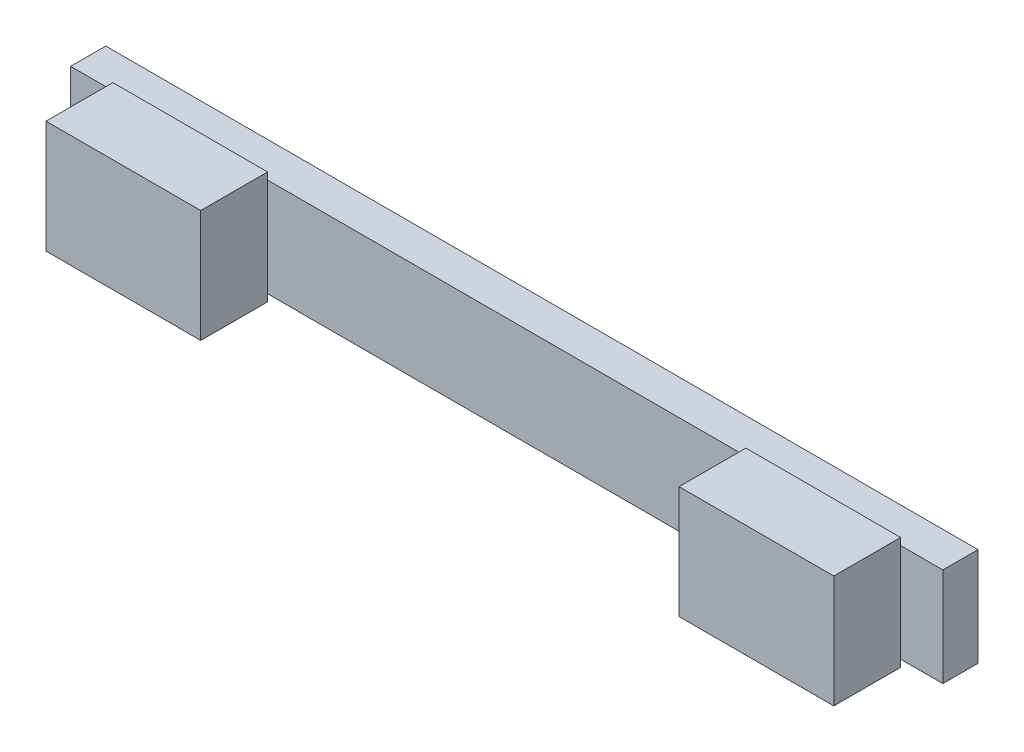
ISO-10303-21;
HEADER;
FILE_DESCRIPTION(('STEP AP214'),'2;1');
FILE_NAME('part.step','',(''),(''),'','','');
FILE_SCHEMA(('AUTOMOTIVE_DESIGN { 1 0 10303 214 1 1 1 1 }'));
ENDSEC;
DATA;
#1=APPLICATION_CONTEXT('core data for automotive mechanical design processes');
#2=APPLICATION_PROTOCOL_DEFINITION('international standard','automotive_design',2000,#1);
#3=PRODUCT_CONTEXT('',#1,'mechanical');
#4=PRODUCT('Part','Part','',(#3));
#5=PRODUCT_RELATED_PRODUCT_CATEGORY('part','',(#4));
#6=PRODUCT_DEFINITION_FORMATION('','',#4);
#7=PRODUCT_DEFINITION_CONTEXT('part definition',#1,'design');
#8=PRODUCT_DEFINITION('design','',#6,#7);
#9=PRODUCT_DEFINITION_SHAPE('','',#8);
#10=(LENGTH_UNIT() NAMED_UNIT(*) SI_UNIT(.MILLI.,.METRE.));
#11=(NAMED_UNIT(*) PLANE_ANGLE_UNIT() SI_UNIT($,.RADIAN.));
#12=(NAMED_UNIT(*) SI_UNIT($,.STERADIAN.) SOLID_ANGLE_UNIT());
#13=UNCERTAINTY_MEASURE_WITH_UNIT(LENGTH_MEASURE(1.E-05),#10,'distance_accuracy_value','');
#14=(GEOMETRIC_REPRESENTATION_CONTEXT(3) GLOBAL_UNCERTAINTY_ASSIGNED_CONTEXT((#13)) GLOBAL_UNIT_ASSIGNED_CONTEXT((#10,
#11,#12)) REPRESENTATION_CONTEXT('',''));
#15=CARTESIAN_POINT('',(0.,0.,0.));
#16=DIRECTION('',(0.,0.,1.));
#17=DIRECTION('',(1.,0.,0.));
#18=AXIS2_PLACEMENT_3D('',#15,#16,#17);
#19=CARTESIAN_POINT('',(0.,0.,-351.));
#20=DIRECTION('',(0.,0.,1.));
#21=DIRECTION('',(1.,0.,0.));
#22=AXIS2_PLACEMENT_3D('',#19,#20,#21);
#23=PLANE('',#22);
#24=DIRECTION('',(0.,-1.,0.));
#25=VECTOR('',#24,1.);
#26=CARTESIAN_POINT('',(274.,8.,-351.));
#27=LINE('',#26,#25);
#28=CARTESIAN_POINT('',(274.,7.,-351.));
#29=VERTEX_POINT('',#28);
#30=CARTESIAN_POINT('',(274.,-7.,-351.));
#31=VERTEX_POINT('',#30);
#32=EDGE_CURVE('E11',#29,#31,#27,.T.);
#33=ORIENTED_EDGE('',*,*,#32,.F.);
#34=DIRECTION('',(-1.,0.,0.));
#35=VECTOR('',#34,1.);
#36=CARTESIAN_POINT('',(302.,7.,-351.));
#37=LINE('',#36,#35);
#38=CARTESIAN_POINT('',(206.,7.,-351.));
#39=VERTEX_POINT('',#38);
#40=EDGE_CURVE('E309',#29,#39,#37,.T.);
#41=ORIENTED_EDGE('',*,*,#40,.T.);
#42=DIRECTION('',(0.,1.,0.));
#43=VECTOR('',#42,1.);
#44=CARTESIAN_POINT('',(206.,-8.,-351.));
#45=LINE('',#44,#43);
#46=CARTESIAN_POINT('',(206.,-7.,-351.));
#47=VERTEX_POINT('',#46);
#48=EDGE_CURVE('E213',#47,#39,#45,.T.);
#49=ORIENTED_EDGE('',*,*,#48,.F.);
#50=DIRECTION('',(1.,0.,0.));
#51=VECTOR('',#50,1.);
#52=CARTESIAN_POINT('',(178.,-7.,-351.));
#53=LINE('',#52,#51);
#54=EDGE_CURVE('E286',#47,#31,#53,.T.);
#55=ORIENTED_EDGE('',*,*,#54,.T.);
#56=EDGE_LOOP('',(#33,#41,#49,#55));
#57=FACE_BOUND('',#56,.T.);
#58=ADVANCED_FACE('F41',(#57),#23,.T.);
#59=DIRECTION('',(0.,-1.,0.));
#60=VECTOR('',#59,1.);
#61=CARTESIAN_POINT('',(184.,8.,-351.));
#62=LINE('',#61,#60);
#63=CARTESIAN_POINT('',(184.,7.,-351.));
#64=VERTEX_POINT('',#63);
#65=CARTESIAN_POINT('',(184.,-7.,-351.));
#66=VERTEX_POINT('',#65);
#67=EDGE_CURVE('E58',#64,#66,#62,.T.);
#68=ORIENTED_EDGE('',*,*,#67,.F.);
#69=CARTESIAN_POINT('',(178.,7.,-351.));
#70=VERTEX_POINT('',#69);
#71=EDGE_CURVE('E237',#64,#70,#37,.T.);
#72=ORIENTED_EDGE('',*,*,#71,.T.);
#73=DIRECTION('',(0.,-1.,0.));
#74=VECTOR('',#73,1.);
#75=CARTESIAN_POINT('',(178.,7.,-351.));
#76=LINE('',#75,#74);
#77=CARTESIAN_POINT('',(178.,-7.,-351.));
#78=VERTEX_POINT('',#77);
#79=EDGE_CURVE('E227',#70,#78,#76,.T.);
#80=ORIENTED_EDGE('',*,*,#79,.T.);
#81=EDGE_CURVE('E232',#78,#66,#53,.T.);
#82=ORIENTED_EDGE('',*,*,#81,.T.);
#83=EDGE_LOOP('',(#68,#72,#80,#82));
#84=FACE_BOUND('',#83,.T.);
#85=ADVANCED_FACE('F342',(#84),#23,.T.);
#86=CARTESIAN_POINT('',(178.,7.,-351.));
#87=DIRECTION('',(1.,0.,0.));
#88=DIRECTION('',(0.,0.,-1.));
#89=AXIS2_PLACEMENT_3D('',#86,#87,#88);
#90=PLANE('',#89);
#91=DIRECTION('',(0.,-1.,0.));
#92=VECTOR('',#91,1.);
#93=CARTESIAN_POINT('',(178.,7.,-356.));
#94=LINE('',#93,#92);
#95=CARTESIAN_POINT('',(178.,7.,-356.));
#96=VERTEX_POINT('',#95);
#97=CARTESIAN_POINT('',(178.,-7.,-356.));
#98=VERTEX_POINT('',#97);
#99=EDGE_CURVE('E181',#96,#98,#94,.T.);
#100=ORIENTED_EDGE('',*,*,#99,.T.);
#101=DIRECTION('',(0.,0.,-1.));
#102=VECTOR('',#101,1.);
#103=CARTESIAN_POINT('',(178.,-7.,-351.));
#104=LINE('',#103,#102);
#105=EDGE_CURVE('E44',#78,#98,#104,.T.);
#106=ORIENTED_EDGE('',*,*,#105,.F.);
#107=ORIENTED_EDGE('',*,*,#79,.F.);
#108=DIRECTION('',(0.,0.,-1.));
#109=VECTOR('',#108,1.);
#110=CARTESIAN_POINT('',(178.,7.,-351.));
#111=LINE('',#110,#109);
#112=EDGE_CURVE('E236',#70,#96,#111,.T.);
#113=ORIENTED_EDGE('',*,*,#112,.T.);
#114=EDGE_LOOP('',(#100,#106,#107,#113));
#115=FACE_BOUND('',#114,.T.);
#116=ADVANCED_FACE('F43',(#115),#90,.F.);
#117=CARTESIAN_POINT('',(178.,-7.,-351.));
#118=DIRECTION('',(0.,1.,0.));
#119=DIRECTION('',(0.,0.,1.));
#120=AXIS2_PLACEMENT_3D('',#117,#118,#119);
#121=PLANE('',#120);
#122=DIRECTION('',(1.,0.,0.));
#123=VECTOR('',#122,1.);
#124=CARTESIAN_POINT('',(178.,-7.,-356.));
#125=LINE('',#124,#123);
#126=CARTESIAN_POINT('',(302.,-7.,-356.));
#127=VERTEX_POINT('',#126);
#128=EDGE_CURVE('E187',#98,#127,#125,.T.);
#129=ORIENTED_EDGE('',*,*,#128,.T.);
#130=DIRECTION('',(0.,0.,-1.));
#131=VECTOR('',#130,1.);
#132=CARTESIAN_POINT('',(302.,-7.,-351.));
#133=LINE('',#132,#131);
#134=CARTESIAN_POINT('',(302.,-7.,-351.));
#135=VERTEX_POINT('',#134);
#136=EDGE_CURVE('E249',#135,#127,#133,.T.);
#137=ORIENTED_EDGE('',*,*,#136,.F.);
#138=CARTESIAN_POINT('',(296.,-7.,-351.));
#139=VERTEX_POINT('',#138);
#140=EDGE_CURVE('E226',#139,#135,#53,.T.);
#141=ORIENTED_EDGE('',*,*,#140,.F.);
#142=EDGE_CURVE('E292',#31,#139,#53,.T.);
#143=ORIENTED_EDGE('',*,*,#142,.F.);
#144=ORIENTED_EDGE('',*,*,#54,.F.);
#145=EDGE_CURVE('E234',#66,#47,#53,.T.);
#146=ORIENTED_EDGE('',*,*,#145,.F.);
#147=ORIENTED_EDGE('',*,*,#81,.F.);
#148=ORIENTED_EDGE('',*,*,#105,.T.);
#149=EDGE_LOOP('',(#129,#137,#141,#143,#144,#146,#147,#148));
#150=FACE_BOUND('',#149,.T.);
#151=ADVANCED_FACE('F302',(#150),#121,.F.);
#152=CARTESIAN_POINT('',(302.,-7.,-351.));
#153=DIRECTION('',(-1.,0.,0.));
#154=DIRECTION('',(0.,0.,1.));
#155=AXIS2_PLACEMENT_3D('',#152,#153,#154);
#156=PLANE('',#155);
#157=DIRECTION('',(0.,1.,0.));
#158=VECTOR('',#157,1.);
#159=CARTESIAN_POINT('',(302.,-7.,-356.));
#160=LINE('',#159,#158);
#161=CARTESIAN_POINT('',(302.,7.,-356.));
#162=VERTEX_POINT('',#161);
#163=EDGE_CURVE('E245',#127,#162,#160,.T.);
#164=ORIENTED_EDGE('',*,*,#163,.T.);
#165=DIRECTION('',(0.,0.,-1.));
#166=VECTOR('',#165,1.);
#167=CARTESIAN_POINT('',(302.,7.,-351.));
#168=LINE('',#167,#166);
#169=CARTESIAN_POINT('',(302.,7.,-351.));
#170=VERTEX_POINT('',#169);
#171=EDGE_CURVE('E250',#170,#162,#168,.T.);
#172=ORIENTED_EDGE('',*,*,#171,.F.);
#173=DIRECTION('',(0.,1.,0.));
#174=VECTOR('',#173,1.);
#175=CARTESIAN_POINT('',(302.,-7.,-351.));
#176=LINE('',#175,#174);
#177=EDGE_CURVE('E233',#135,#170,#176,.T.);
#178=ORIENTED_EDGE('',*,*,#177,.F.);
#179=ORIENTED_EDGE('',*,*,#136,.T.);
#180=EDGE_LOOP('',(#164,#172,#178,#179));
#181=FACE_BOUND('',#180,.T.);
#182=ADVANCED_FACE('F305',(#181),#156,.F.);
#183=CARTESIAN_POINT('',(302.,7.,-351.));
#184=DIRECTION('',(0.,-1.,0.));
#185=DIRECTION('',(0.,0.,-1.));
#186=AXIS2_PLACEMENT_3D('',#183,#184,#185);
#187=PLANE('',#186);
#188=DIRECTION('',(-1.,0.,0.));
#189=VECTOR('',#188,1.);
#190=CARTESIAN_POINT('',(302.,7.,-356.));
#191=LINE('',#190,#189);
#192=EDGE_CURVE('E228',#162,#96,#191,.T.);
#193=ORIENTED_EDGE('',*,*,#192,.T.);
#194=ORIENTED_EDGE('',*,*,#112,.F.);
#195=ORIENTED_EDGE('',*,*,#71,.F.);
#196=EDGE_CURVE('E273',#39,#64,#37,.T.);
#197=ORIENTED_EDGE('',*,*,#196,.F.);
#198=ORIENTED_EDGE('',*,*,#40,.F.);
#199=CARTESIAN_POINT('',(296.,7.,-351.));
#200=VERTEX_POINT('',#199);
#201=EDGE_CURVE('E239',#200,#29,#37,.T.);
#202=ORIENTED_EDGE('',*,*,#201,.F.);
#203=EDGE_CURVE('E240',#170,#200,#37,.T.);
#204=ORIENTED_EDGE('',*,*,#203,.F.);
#205=ORIENTED_EDGE('',*,*,#171,.T.);
#206=EDGE_LOOP('',(#193,#194,#195,#197,#198,#202,#204,#205));
#207=FACE_BOUND('',#206,.T.);
#208=ADVANCED_FACE('F307',(#207),#187,.F.);
#209=DIRECTION('',(0.,1.,0.));
#210=VECTOR('',#209,1.);
#211=CARTESIAN_POINT('',(296.,-8.,-351.));
#212=LINE('',#211,#210);
#213=EDGE_CURVE('E49',#139,#200,#212,.T.);
#214=ORIENTED_EDGE('',*,*,#213,.F.);
#215=ORIENTED_EDGE('',*,*,#140,.T.);
#216=ORIENTED_EDGE('',*,*,#177,.T.);
#217=ORIENTED_EDGE('',*,*,#203,.T.);
#218=EDGE_LOOP('',(#214,#215,#216,#217));
#219=FACE_BOUND('',#218,.T.);
#220=ADVANCED_FACE('F299',(#219),#23,.T.);
#221=CARTESIAN_POINT('',(0.,0.,-356.));
#222=DIRECTION('',(0.,0.,1.));
#223=DIRECTION('',(1.,0.,0.));
#224=AXIS2_PLACEMENT_3D('',#221,#222,#223);
#225=PLANE('',#224);
#226=ORIENTED_EDGE('',*,*,#99,.F.);
#227=ORIENTED_EDGE('',*,*,#192,.F.);
#228=ORIENTED_EDGE('',*,*,#163,.F.);
#229=ORIENTED_EDGE('',*,*,#128,.F.);
#230=EDGE_LOOP('',(#226,#227,#228,#229));
#231=FACE_BOUND('',#230,.T.);
#232=ADVANCED_FACE('F346',(#231),#225,.F.);
#233=CARTESIAN_POINT('',(0.,0.,-351.));
#234=DIRECTION('',(0.,0.,1.));
#235=DIRECTION('',(1.,0.,0.));
#236=AXIS2_PLACEMENT_3D('',#233,#234,#235);
#237=PLANE('',#236);
#238=CARTESIAN_POINT('',(184.,-8.,-351.));
#239=VERTEX_POINT('',#238);
#240=EDGE_CURVE('E210',#66,#239,#62,.T.);
#241=ORIENTED_EDGE('',*,*,#240,.F.);
#242=ORIENTED_EDGE('',*,*,#145,.T.);
#243=CARTESIAN_POINT('',(206.,-8.,-351.));
#244=VERTEX_POINT('',#243);
#245=EDGE_CURVE('E209',#244,#47,#45,.T.);
#246=ORIENTED_EDGE('',*,*,#245,.F.);
#247=DIRECTION('',(1.,0.,0.));
#248=VECTOR('',#247,1.);
#249=CARTESIAN_POINT('',(184.,-8.,-351.));
#250=LINE('',#249,#248);
#251=EDGE_CURVE('E206',#239,#244,#250,.T.);
#252=ORIENTED_EDGE('',*,*,#251,.F.);
#253=EDGE_LOOP('',(#241,#242,#246,#252));
#254=FACE_BOUND('',#253,.T.);
#255=ADVANCED_FACE('F288',(#254),#237,.F.);
#256=CARTESIAN_POINT('',(206.,8.,-351.));
#257=VERTEX_POINT('',#256);
#258=EDGE_CURVE('E207',#39,#257,#45,.T.);
#259=ORIENTED_EDGE('',*,*,#258,.F.);
#260=ORIENTED_EDGE('',*,*,#196,.T.);
#261=CARTESIAN_POINT('',(184.,8.,-351.));
#262=VERTEX_POINT('',#261);
#263=EDGE_CURVE('E201',#262,#64,#62,.T.);
#264=ORIENTED_EDGE('',*,*,#263,.F.);
#265=DIRECTION('',(-1.,0.,0.));
#266=VECTOR('',#265,1.);
#267=CARTESIAN_POINT('',(206.,8.,-351.));
#268=LINE('',#267,#266);
#269=EDGE_CURVE('E198',#257,#262,#268,.T.);
#270=ORIENTED_EDGE('',*,*,#269,.F.);
#271=EDGE_LOOP('',(#259,#260,#264,#270));
#272=FACE_BOUND('',#271,.T.);
#273=ADVANCED_FACE('F275',(#272),#237,.F.);
#274=CARTESIAN_POINT('',(184.,8.,-341.5));
#275=DIRECTION('',(1.,0.,0.));
#276=DIRECTION('',(0.,0.,-1.));
#277=AXIS2_PLACEMENT_3D('',#274,#275,#276);
#278=PLANE('',#277);
#279=ORIENTED_EDGE('',*,*,#263,.T.);
#280=ORIENTED_EDGE('',*,*,#67,.T.);
#281=ORIENTED_EDGE('',*,*,#240,.T.);
#282=DIRECTION('',(0.,0.,-1.));
#283=VECTOR('',#282,1.);
#284=CARTESIAN_POINT('',(184.,-8.,-341.5));
#285=LINE('',#284,#283);
#286=CARTESIAN_POINT('',(184.,-8.,-341.5));
#287=VERTEX_POINT('',#286);
#288=EDGE_CURVE('E224',#287,#239,#285,.T.);
#289=ORIENTED_EDGE('',*,*,#288,.F.);
#290=DIRECTION('',(0.,-1.,0.));
#291=VECTOR('',#290,1.);
#292=CARTESIAN_POINT('',(184.,8.,-341.5));
#293=LINE('',#292,#291);
#294=CARTESIAN_POINT('',(184.,8.,-341.5));
#295=VERTEX_POINT('',#294);
#296=EDGE_CURVE('E195',#295,#287,#293,.T.);
#297=ORIENTED_EDGE('',*,*,#296,.F.);
#298=DIRECTION('',(0.,0.,-1.));
#299=VECTOR('',#298,1.);
#300=CARTESIAN_POINT('',(184.,8.,-341.5));
#301=LINE('',#300,#299);
#302=EDGE_CURVE('E205',#295,#262,#301,.T.);
#303=ORIENTED_EDGE('',*,*,#302,.T.);
#304=EDGE_LOOP('',(#279,#280,#281,#289,#297,#303));
#305=FACE_BOUND('',#304,.T.);
#306=ADVANCED_FACE('F277',(#305),#278,.F.);
#307=CARTESIAN_POINT('',(184.,-8.,-341.5));
#308=DIRECTION('',(0.,1.,0.));
#309=DIRECTION('',(0.,0.,1.));
#310=AXIS2_PLACEMENT_3D('',#307,#308,#309);
#311=PLANE('',#310);
#312=ORIENTED_EDGE('',*,*,#251,.T.);
#313=DIRECTION('',(0.,0.,-1.));
#314=VECTOR('',#313,1.);
#315=CARTESIAN_POINT('',(206.,-8.,-341.5));
#316=LINE('',#315,#314);
#317=CARTESIAN_POINT('',(206.,-8.,-341.5));
#318=VERTEX_POINT('',#317);
#319=EDGE_CURVE('E219',#318,#244,#316,.T.);
#320=ORIENTED_EDGE('',*,*,#319,.F.);
#321=DIRECTION('',(1.,0.,0.));
#322=VECTOR('',#321,1.);
#323=CARTESIAN_POINT('',(184.,-8.,-341.5));
#324=LINE('',#323,#322);
#325=EDGE_CURVE('E191',#287,#318,#324,.T.);
#326=ORIENTED_EDGE('',*,*,#325,.F.);
#327=ORIENTED_EDGE('',*,*,#288,.T.);
#328=EDGE_LOOP('',(#312,#320,#326,#327));
#329=FACE_BOUND('',#328,.T.);
#330=ADVANCED_FACE('F483',(#329),#311,.F.);
#331=CARTESIAN_POINT('',(206.,-8.,-341.5));
#332=DIRECTION('',(-1.,0.,0.));
#333=DIRECTION('',(0.,0.,1.));
#334=AXIS2_PLACEMENT_3D('',#331,#332,#333);
#335=PLANE('',#334);
#336=ORIENTED_EDGE('',*,*,#245,.T.);
#337=ORIENTED_EDGE('',*,*,#48,.T.);
#338=ORIENTED_EDGE('',*,*,#258,.T.);
#339=DIRECTION('',(0.,0.,-1.));
#340=VECTOR('',#339,1.);
#341=CARTESIAN_POINT('',(206.,8.,-341.5));
#342=LINE('',#341,#340);
#343=CARTESIAN_POINT('',(206.,8.,-341.5));
#344=VERTEX_POINT('',#343);
#345=EDGE_CURVE('E220',#344,#257,#342,.T.);
#346=ORIENTED_EDGE('',*,*,#345,.F.);
#347=DIRECTION('',(0.,1.,0.));
#348=VECTOR('',#347,1.);
#349=CARTESIAN_POINT('',(206.,-8.,-341.5));
#350=LINE('',#349,#348);
#351=EDGE_CURVE('E196',#318,#344,#350,.T.);
#352=ORIENTED_EDGE('',*,*,#351,.F.);
#353=ORIENTED_EDGE('',*,*,#319,.T.);
#354=EDGE_LOOP('',(#336,#337,#338,#346,#352,#353));
#355=FACE_BOUND('',#354,.T.);
#356=ADVANCED_FACE('F265',(#355),#335,.F.);
#357=CARTESIAN_POINT('',(206.,8.,-341.5));
#358=DIRECTION('',(0.,-1.,0.));
#359=DIRECTION('',(0.,0.,-1.));
#360=AXIS2_PLACEMENT_3D('',#357,#358,#359);
#361=PLANE('',#360);
#362=ORIENTED_EDGE('',*,*,#269,.T.);
#363=ORIENTED_EDGE('',*,*,#302,.F.);
#364=DIRECTION('',(-1.,0.,0.));
#365=VECTOR('',#364,1.);
#366=CARTESIAN_POINT('',(206.,8.,-341.5));
#367=LINE('',#366,#365);
#368=EDGE_CURVE('E199',#344,#295,#367,.T.);
#369=ORIENTED_EDGE('',*,*,#368,.F.);
#370=ORIENTED_EDGE('',*,*,#345,.T.);
#371=EDGE_LOOP('',(#362,#363,#369,#370));
#372=FACE_BOUND('',#371,.T.);
#373=ADVANCED_FACE('F267',(#372),#361,.F.);
#374=CARTESIAN_POINT('',(0.,0.,-341.5));
#375=DIRECTION('',(0.,0.,1.));
#376=DIRECTION('',(1.,0.,0.));
#377=AXIS2_PLACEMENT_3D('',#374,#375,#376);
#378=PLANE('',#377);
#379=ORIENTED_EDGE('',*,*,#296,.T.);
#380=ORIENTED_EDGE('',*,*,#325,.T.);
#381=ORIENTED_EDGE('',*,*,#351,.T.);
#382=ORIENTED_EDGE('',*,*,#368,.T.);
#383=EDGE_LOOP('',(#379,#380,#381,#382));
#384=FACE_BOUND('',#383,.T.);
#385=ADVANCED_FACE('F278',(#384),#378,.T.);
#386=CARTESIAN_POINT('',(0.,0.,-351.));
#387=DIRECTION('',(0.,0.,1.));
#388=DIRECTION('',(1.,0.,0.));
#389=AXIS2_PLACEMENT_3D('',#386,#387,#388);
#390=PLANE('',#389);
#391=CARTESIAN_POINT('',(274.,-8.,-351.));
#392=VERTEX_POINT('',#391);
#393=EDGE_CURVE('E52',#31,#392,#27,.T.);
#394=ORIENTED_EDGE('',*,*,#393,.F.);
#395=ORIENTED_EDGE('',*,*,#142,.T.);
#396=CARTESIAN_POINT('',(296.,-8.,-351.));
#397=VERTEX_POINT('',#396);
#398=EDGE_CURVE('E317',#397,#139,#212,.T.);
#399=ORIENTED_EDGE('',*,*,#398,.F.);
#400=DIRECTION('',(1.,0.,0.));
#401=VECTOR('',#400,1.);
#402=CARTESIAN_POINT('',(274.,-8.,-351.));
#403=LINE('',#402,#401);
#404=EDGE_CURVE('E319',#392,#397,#403,.T.);
#405=ORIENTED_EDGE('',*,*,#404,.F.);
#406=EDGE_LOOP('',(#394,#395,#399,#405));
#407=FACE_BOUND('',#406,.T.);
#408=ADVANCED_FACE('F332',(#407),#390,.F.);
#409=CARTESIAN_POINT('',(296.,8.,-351.));
#410=VERTEX_POINT('',#409);
#411=EDGE_CURVE('E314',#200,#410,#212,.T.);
#412=ORIENTED_EDGE('',*,*,#411,.F.);
#413=ORIENTED_EDGE('',*,*,#201,.T.);
#414=CARTESIAN_POINT('',(274.,8.,-351.));
#415=VERTEX_POINT('',#414);
#416=EDGE_CURVE('E55',#415,#29,#27,.T.);
#417=ORIENTED_EDGE('',*,*,#416,.F.);
#418=DIRECTION('',(-1.,0.,0.));
#419=VECTOR('',#418,1.);
#420=CARTESIAN_POINT('',(296.,8.,-351.));
#421=LINE('',#420,#419);
#422=EDGE_CURVE('E180',#410,#415,#421,.T.);
#423=ORIENTED_EDGE('',*,*,#422,.F.);
#424=EDGE_LOOP('',(#412,#413,#417,#423));
#425=FACE_BOUND('',#424,.T.);
#426=ADVANCED_FACE('F312',(#425),#390,.F.);
#427=CARTESIAN_POINT('',(274.,8.,-341.5));
#428=DIRECTION('',(1.,0.,0.));
#429=DIRECTION('',(0.,0.,-1.));
#430=AXIS2_PLACEMENT_3D('',#427,#428,#429);
#431=PLANE('',#430);
#432=ORIENTED_EDGE('',*,*,#416,.T.);
#433=ORIENTED_EDGE('',*,*,#32,.T.);
#434=ORIENTED_EDGE('',*,*,#393,.T.);
#435=DIRECTION('',(0.,0.,-1.));
#436=VECTOR('',#435,1.);
#437=CARTESIAN_POINT('',(274.,-8.,-341.5));
#438=LINE('',#437,#436);
#439=CARTESIAN_POINT('',(274.,-8.,-341.5));
#440=VERTEX_POINT('',#439);
#441=EDGE_CURVE('E165',#440,#392,#438,.T.);
#442=ORIENTED_EDGE('',*,*,#441,.F.);
#443=DIRECTION('',(0.,-1.,0.));
#444=VECTOR('',#443,1.);
#445=CARTESIAN_POINT('',(274.,8.,-341.5));
#446=LINE('',#445,#444);
#447=CARTESIAN_POINT('',(274.,8.,-341.5));
#448=VERTEX_POINT('',#447);
#449=EDGE_CURVE('E169',#448,#440,#446,.T.);
#450=ORIENTED_EDGE('',*,*,#449,.F.);
#451=DIRECTION('',(0.,0.,-1.));
#452=VECTOR('',#451,1.);
#453=CARTESIAN_POINT('',(274.,8.,-341.5));
#454=LINE('',#453,#452);
#455=EDGE_CURVE('E330',#448,#415,#454,.T.);
#456=ORIENTED_EDGE('',*,*,#455,.T.);
#457=EDGE_LOOP('',(#432,#433,#434,#442,#450,#456));
#458=FACE_BOUND('',#457,.T.);
#459=ADVANCED_FACE('F176',(#458),#431,.F.);
#460=CARTESIAN_POINT('',(274.,-8.,-341.5));
#461=DIRECTION('',(0.,1.,0.));
#462=DIRECTION('',(0.,0.,1.));
#463=AXIS2_PLACEMENT_3D('',#460,#461,#462);
#464=PLANE('',#463);
#465=ORIENTED_EDGE('',*,*,#404,.T.);
#466=DIRECTION('',(0.,0.,-1.));
#467=VECTOR('',#466,1.);
#468=CARTESIAN_POINT('',(296.,-8.,-341.5));
#469=LINE('',#468,#467);
#470=CARTESIAN_POINT('',(296.,-8.,-341.5));
#471=VERTEX_POINT('',#470);
#472=EDGE_CURVE('E163',#471,#397,#469,.T.);
#473=ORIENTED_EDGE('',*,*,#472,.F.);
#474=DIRECTION('',(1.,0.,0.));
#475=VECTOR('',#474,1.);
#476=CARTESIAN_POINT('',(274.,-8.,-341.5));
#477=LINE('',#476,#475);
#478=EDGE_CURVE('E158',#440,#471,#477,.T.);
#479=ORIENTED_EDGE('',*,*,#478,.F.);
#480=ORIENTED_EDGE('',*,*,#441,.T.);
#481=EDGE_LOOP('',(#465,#473,#479,#480));
#482=FACE_BOUND('',#481,.T.);
#483=ADVANCED_FACE('F159',(#482),#464,.F.);
#484=CARTESIAN_POINT('',(296.,-8.,-341.5));
#485=DIRECTION('',(-1.,0.,0.));
#486=DIRECTION('',(0.,0.,1.));
#487=AXIS2_PLACEMENT_3D('',#484,#485,#486);
#488=PLANE('',#487);
#489=ORIENTED_EDGE('',*,*,#398,.T.);
#490=ORIENTED_EDGE('',*,*,#213,.T.);
#491=ORIENTED_EDGE('',*,*,#411,.T.);
#492=DIRECTION('',(0.,0.,-1.));
#493=VECTOR('',#492,1.);
#494=CARTESIAN_POINT('',(296.,8.,-341.5));
#495=LINE('',#494,#493);
#496=CARTESIAN_POINT('',(296.,8.,-341.5));
#497=VERTEX_POINT('',#496);
#498=EDGE_CURVE('E189',#497,#410,#495,.T.);
#499=ORIENTED_EDGE('',*,*,#498,.F.);
#500=DIRECTION('',(0.,1.,0.));
#501=VECTOR('',#500,1.);
#502=CARTESIAN_POINT('',(296.,-8.,-341.5));
#503=LINE('',#502,#501);
#504=EDGE_CURVE('E170',#471,#497,#503,.T.);
#505=ORIENTED_EDGE('',*,*,#504,.F.);
#506=ORIENTED_EDGE('',*,*,#472,.T.);
#507=EDGE_LOOP('',(#489,#490,#491,#499,#505,#506));
#508=FACE_BOUND('',#507,.T.);
#509=ADVANCED_FACE('F325',(#508),#488,.F.);
#510=CARTESIAN_POINT('',(296.,8.,-341.5));
#511=DIRECTION('',(0.,-1.,0.));
#512=DIRECTION('',(0.,0.,-1.));
#513=AXIS2_PLACEMENT_3D('',#510,#511,#512);
#514=PLANE('',#513);
#515=ORIENTED_EDGE('',*,*,#422,.T.);
#516=ORIENTED_EDGE('',*,*,#455,.F.);
#517=DIRECTION('',(-1.,0.,0.));
#518=VECTOR('',#517,1.);
#519=CARTESIAN_POINT('',(296.,8.,-341.5));
#520=LINE('',#519,#518);
#521=EDGE_CURVE('E174',#497,#448,#520,.T.);
#522=ORIENTED_EDGE('',*,*,#521,.F.);
#523=ORIENTED_EDGE('',*,*,#498,.T.);
#524=EDGE_LOOP('',(#515,#516,#522,#523));
#525=FACE_BOUND('',#524,.T.);
#526=ADVANCED_FACE('F327',(#525),#514,.F.);
#527=CARTESIAN_POINT('',(0.,0.,-341.5));
#528=DIRECTION('',(0.,0.,1.));
#529=DIRECTION('',(1.,0.,0.));
#530=AXIS2_PLACEMENT_3D('',#527,#528,#529);
#531=PLANE('',#530);
#532=ORIENTED_EDGE('',*,*,#449,.T.);
#533=ORIENTED_EDGE('',*,*,#478,.T.);
#534=ORIENTED_EDGE('',*,*,#504,.T.);
#535=ORIENTED_EDGE('',*,*,#521,.T.);
#536=EDGE_LOOP('',(#532,#533,#534,#535));
#537=FACE_BOUND('',#536,.T.);
#538=ADVANCED_FACE('F172',(#537),#531,.T.);
#539=CLOSED_SHELL('',(#58,#85,#116,#151,#182,#208,#220,#232,#255,#273,#306,#330,#356,#373,#385,
#408,#426,#459,#483,#509,#526,#538));
#540=MANIFOLD_SOLID_BREP('B2',#539);
#541=ADVANCED_BREP_SHAPE_REPRESENTATION('',(#18,#540),#14);
#542=SHAPE_DEFINITION_REPRESENTATION(#9,#541);
ENDSEC;
END-ISO-10303-21;
